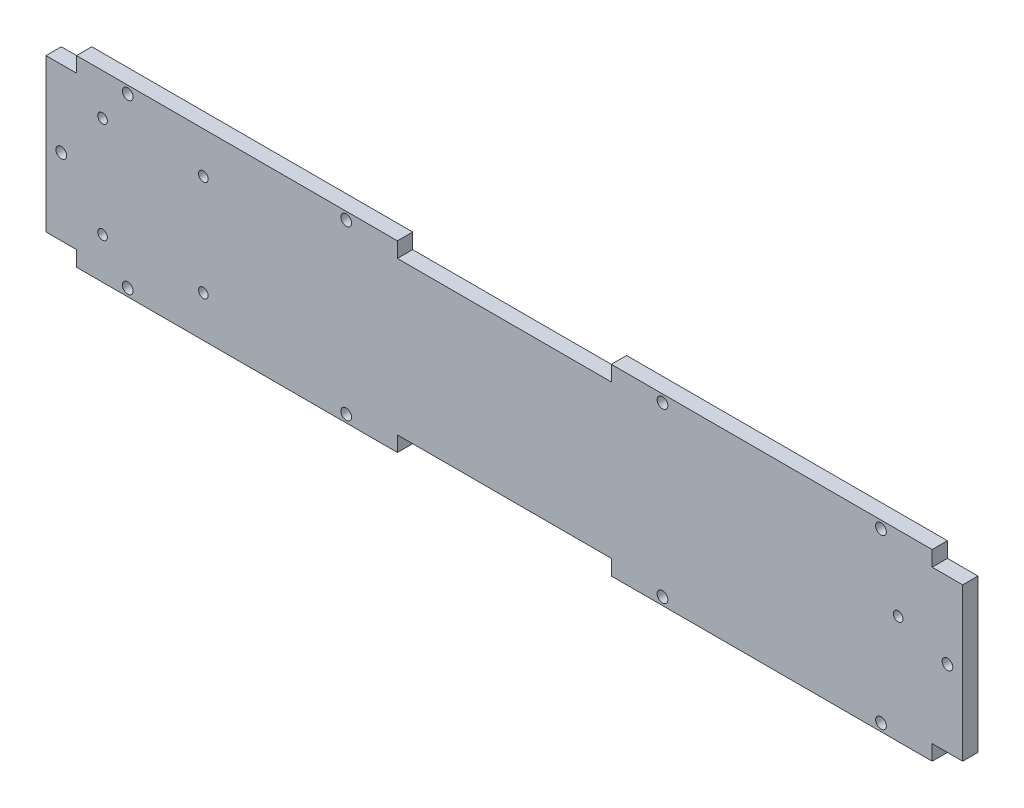
ISO-10303-21;
HEADER;
FILE_DESCRIPTION(('STEP AP214'),'2;1');
FILE_NAME('part.step','',(''),(''),'','','');
FILE_SCHEMA(('AUTOMOTIVE_DESIGN { 1 0 10303 214 1 1 1 1 }'));
ENDSEC;
DATA;
#1=APPLICATION_CONTEXT('core data for automotive mechanical design processes');
#2=APPLICATION_PROTOCOL_DEFINITION('international standard','automotive_design',2000,#1);
#3=PRODUCT_CONTEXT('',#1,'mechanical');
#4=PRODUCT('Part','Part','',(#3));
#5=PRODUCT_RELATED_PRODUCT_CATEGORY('part','',(#4));
#6=PRODUCT_DEFINITION_FORMATION('','',#4);
#7=PRODUCT_DEFINITION_CONTEXT('part definition',#1,'design');
#8=PRODUCT_DEFINITION('design','',#6,#7);
#9=PRODUCT_DEFINITION_SHAPE('','',#8);
#10=(LENGTH_UNIT() NAMED_UNIT(*) SI_UNIT(.MILLI.,.METRE.));
#11=(NAMED_UNIT(*) PLANE_ANGLE_UNIT() SI_UNIT($,.RADIAN.));
#12=(NAMED_UNIT(*) SI_UNIT($,.STERADIAN.) SOLID_ANGLE_UNIT());
#13=UNCERTAINTY_MEASURE_WITH_UNIT(LENGTH_MEASURE(1.E-05),#10,'distance_accuracy_value','');
#14=(GEOMETRIC_REPRESENTATION_CONTEXT(3) GLOBAL_UNCERTAINTY_ASSIGNED_CONTEXT((#13)) GLOBAL_UNIT_ASSIGNED_CONTEXT((#10,
#11,#12)) REPRESENTATION_CONTEXT('',''));
#15=CARTESIAN_POINT('',(0.,0.,0.));
#16=DIRECTION('',(0.,0.,1.));
#17=DIRECTION('',(1.,0.,0.));
#18=AXIS2_PLACEMENT_3D('',#15,#16,#17);
#19=CARTESIAN_POINT('',(35.,0.,5.));
#20=DIRECTION('',(-1.,0.,0.));
#21=DIRECTION('',(0.,0.,1.));
#22=AXIS2_PLACEMENT_3D('',#19,#20,#21);
#23=PLANE('',#22);
#24=DIRECTION('',(0.,1.,0.));
#25=VECTOR('',#24,1.);
#26=CARTESIAN_POINT('',(35.,0.,0.));
#27=LINE('',#26,#25);
#28=CARTESIAN_POINT('',(35.,-5.,0.));
#29=VERTEX_POINT('',#28);
#30=CARTESIAN_POINT('',(35.,0.,0.));
#31=VERTEX_POINT('',#30);
#32=EDGE_CURVE('E455',#29,#31,#27,.T.);
#33=ORIENTED_EDGE('',*,*,#32,.F.);
#34=DIRECTION('',(0.,0.,-1.));
#35=VECTOR('',#34,1.);
#36=CARTESIAN_POINT('',(35.,-5.,5.));
#37=LINE('',#36,#35);
#38=CARTESIAN_POINT('',(35.,-5.,5.));
#39=VERTEX_POINT('',#38);
#40=EDGE_CURVE('E424',#39,#29,#37,.T.);
#41=ORIENTED_EDGE('',*,*,#40,.F.);
#42=DIRECTION('',(0.,1.,0.));
#43=VECTOR('',#42,1.);
#44=CARTESIAN_POINT('',(35.,0.,5.));
#45=LINE('',#44,#43);
#46=CARTESIAN_POINT('',(35.,0.,5.));
#47=VERTEX_POINT('',#46);
#48=EDGE_CURVE('E472',#39,#47,#45,.T.);
#49=ORIENTED_EDGE('',*,*,#48,.T.);
#50=DIRECTION('',(0.,0.,-1.));
#51=VECTOR('',#50,1.);
#52=CARTESIAN_POINT('',(35.,0.,5.));
#53=LINE('',#52,#51);
#54=EDGE_CURVE('E420',#47,#31,#53,.T.);
#55=ORIENTED_EDGE('',*,*,#54,.T.);
#56=EDGE_LOOP('',(#33,#41,#49,#55));
#57=FACE_BOUND('',#56,.T.);
#58=ADVANCED_FACE('F161',(#57),#23,.T.);
#59=CARTESIAN_POINT('',(0.,-5.,5.));
#60=DIRECTION('',(0.,-1.,0.));
#61=DIRECTION('',(0.,0.,-1.));
#62=AXIS2_PLACEMENT_3D('',#59,#60,#61);
#63=PLANE('',#62);
#64=DIRECTION('',(-1.,0.,0.));
#65=VECTOR('',#64,1.);
#66=CARTESIAN_POINT('',(0.,-5.,0.));
#67=LINE('',#66,#65);
#68=CARTESIAN_POINT('',(140.,-5.,0.));
#69=VERTEX_POINT('',#68);
#70=EDGE_CURVE('E451',#69,#29,#67,.T.);
#71=ORIENTED_EDGE('',*,*,#70,.F.);
#72=DIRECTION('',(0.,0.,-1.));
#73=VECTOR('',#72,1.);
#74=CARTESIAN_POINT('',(140.,-5.,5.));
#75=LINE('',#74,#73);
#76=CARTESIAN_POINT('',(140.,-5.,5.));
#77=VERTEX_POINT('',#76);
#78=EDGE_CURVE('E428',#77,#69,#75,.T.);
#79=ORIENTED_EDGE('',*,*,#78,.F.);
#80=DIRECTION('',(-1.,0.,0.));
#81=VECTOR('',#80,1.);
#82=CARTESIAN_POINT('',(0.,-5.,5.));
#83=LINE('',#82,#81);
#84=EDGE_CURVE('E468',#77,#39,#83,.T.);
#85=ORIENTED_EDGE('',*,*,#84,.T.);
#86=ORIENTED_EDGE('',*,*,#40,.T.);
#87=EDGE_LOOP('',(#71,#79,#85,#86));
#88=FACE_BOUND('',#87,.T.);
#89=ADVANCED_FACE('F653',(#88),#63,.T.);
#90=CARTESIAN_POINT('',(140.,0.,5.));
#91=DIRECTION('',(-1.,0.,0.));
#92=DIRECTION('',(0.,0.,1.));
#93=AXIS2_PLACEMENT_3D('',#90,#91,#92);
#94=PLANE('',#93);
#95=DIRECTION('',(0.,0.,-1.));
#96=VECTOR('',#95,1.);
#97=CARTESIAN_POINT('',(140.,0.,5.));
#98=LINE('',#97,#96);
#99=CARTESIAN_POINT('',(140.,0.,5.));
#100=VERTEX_POINT('',#99);
#101=CARTESIAN_POINT('',(140.,0.,0.));
#102=VERTEX_POINT('',#101);
#103=EDGE_CURVE('E172',#100,#102,#98,.T.);
#104=ORIENTED_EDGE('',*,*,#103,.F.);
#105=DIRECTION('',(0.,1.,0.));
#106=VECTOR('',#105,1.);
#107=CARTESIAN_POINT('',(140.,0.,5.));
#108=LINE('',#107,#106);
#109=EDGE_CURVE('E464',#77,#100,#108,.T.);
#110=ORIENTED_EDGE('',*,*,#109,.F.);
#111=ORIENTED_EDGE('',*,*,#78,.T.);
#112=DIRECTION('',(0.,1.,0.));
#113=VECTOR('',#112,1.);
#114=CARTESIAN_POINT('',(140.,0.,0.));
#115=LINE('',#114,#113);
#116=EDGE_CURVE('E447',#69,#102,#115,.T.);
#117=ORIENTED_EDGE('',*,*,#116,.T.);
#118=EDGE_LOOP('',(#104,#110,#111,#117));
#119=FACE_BOUND('',#118,.T.);
#120=ADVANCED_FACE('F679',(#119),#94,.F.);
#121=CARTESIAN_POINT('',(0.,50.,5.));
#122=DIRECTION('',(0.,1.,0.));
#123=DIRECTION('',(0.,0.,1.));
#124=AXIS2_PLACEMENT_3D('',#121,#122,#123);
#125=PLANE('',#124);
#126=DIRECTION('',(0.,0.,-1.));
#127=VECTOR('',#126,1.);
#128=CARTESIAN_POINT('',(-35.,50.,5.));
#129=LINE('',#128,#127);
#130=CARTESIAN_POINT('',(-35.,50.,5.));
#131=VERTEX_POINT('',#130);
#132=CARTESIAN_POINT('',(-35.,50.,0.));
#133=VERTEX_POINT('',#132);
#134=EDGE_CURVE('E416',#131,#133,#129,.T.);
#135=ORIENTED_EDGE('',*,*,#134,.F.);
#136=DIRECTION('',(1.,0.,0.));
#137=VECTOR('',#136,1.);
#138=CARTESIAN_POINT('',(0.,50.,5.));
#139=LINE('',#138,#137);
#140=CARTESIAN_POINT('',(35.,50.,5.));
#141=VERTEX_POINT('',#140);
#142=EDGE_CURVE('E442',#131,#141,#139,.T.);
#143=ORIENTED_EDGE('',*,*,#142,.T.);
#144=DIRECTION('',(0.,0.,-1.));
#145=VECTOR('',#144,1.);
#146=CARTESIAN_POINT('',(35.,50.,5.));
#147=LINE('',#146,#145);
#148=CARTESIAN_POINT('',(35.,50.,0.));
#149=VERTEX_POINT('',#148);
#150=EDGE_CURVE('E165',#141,#149,#147,.T.);
#151=ORIENTED_EDGE('',*,*,#150,.T.);
#152=DIRECTION('',(1.,0.,0.));
#153=VECTOR('',#152,1.);
#154=CARTESIAN_POINT('',(0.,50.,0.));
#155=LINE('',#154,#153);
#156=EDGE_CURVE('E443',#133,#149,#155,.T.);
#157=ORIENTED_EDGE('',*,*,#156,.F.);
#158=EDGE_LOOP('',(#135,#143,#151,#157));
#159=FACE_BOUND('',#158,.T.);
#160=ADVANCED_FACE('F738',(#159),#125,.T.);
#161=CARTESIAN_POINT('',(0.,0.,5.));
#162=DIRECTION('',(0.,-1.,0.));
#163=DIRECTION('',(0.,0.,-1.));
#164=AXIS2_PLACEMENT_3D('',#161,#162,#163);
#165=PLANE('',#164);
#166=DIRECTION('',(-1.,0.,0.));
#167=VECTOR('',#166,1.);
#168=CARTESIAN_POINT('',(0.,0.,5.));
#169=LINE('',#168,#167);
#170=CARTESIAN_POINT('',(-35.,0.,5.));
#171=VERTEX_POINT('',#170);
#172=EDGE_CURVE('E446',#47,#171,#169,.T.);
#173=ORIENTED_EDGE('',*,*,#172,.T.);
#174=DIRECTION('',(0.,0.,-1.));
#175=VECTOR('',#174,1.);
#176=CARTESIAN_POINT('',(-35.,0.,5.));
#177=LINE('',#176,#175);
#178=CARTESIAN_POINT('',(-35.,0.,0.));
#179=VERTEX_POINT('',#178);
#180=EDGE_CURVE('E12',#171,#179,#177,.T.);
#181=ORIENTED_EDGE('',*,*,#180,.T.);
#182=DIRECTION('',(-1.,0.,0.));
#183=VECTOR('',#182,1.);
#184=CARTESIAN_POINT('',(0.,0.,0.));
#185=LINE('',#184,#183);
#186=EDGE_CURVE('E392',#31,#179,#185,.T.);
#187=ORIENTED_EDGE('',*,*,#186,.F.);
#188=ORIENTED_EDGE('',*,*,#54,.F.);
#189=EDGE_LOOP('',(#173,#181,#187,#188));
#190=FACE_BOUND('',#189,.T.);
#191=ADVANCED_FACE('F716',(#190),#165,.T.);
#192=CARTESIAN_POINT('',(0.,0.,0.));
#193=DIRECTION('',(0.,0.,1.));
#194=DIRECTION('',(1.,0.,0.));
#195=AXIS2_PLACEMENT_3D('',#192,#193,#194);
#196=PLANE('',#195);
#197=CARTESIAN_POINT('',(-98.5,41.5,0.));
#198=DIRECTION('',(0.,0.,1.));
#199=DIRECTION('',(-1.,0.,0.));
#200=AXIS2_PLACEMENT_3D('',#197,#198,#199);
#201=CIRCLE('',#200,1.57499999999993);
#202=CARTESIAN_POINT('',(-100.075,41.5,0.));
#203=VERTEX_POINT('',#202);
#204=EDGE_CURVE('E559',#203,#203,#201,.T.);
#205=ORIENTED_EDGE('',*,*,#204,.T.);
#206=EDGE_LOOP('',(#205));
#207=FACE_BOUND('',#206,.T.);
#208=CARTESIAN_POINT('',(-98.5,8.5,0.));
#209=DIRECTION('',(0.,0.,1.));
#210=DIRECTION('',(1.,0.,0.));
#211=AXIS2_PLACEMENT_3D('',#208,#209,#210);
#212=CIRCLE('',#211,1.57499999999993);
#213=CARTESIAN_POINT('',(-96.9250000000001,8.5,0.));
#214=VERTEX_POINT('',#213);
#215=EDGE_CURVE('E567',#214,#214,#212,.T.);
#216=ORIENTED_EDGE('',*,*,#215,.T.);
#217=EDGE_LOOP('',(#216));
#218=FACE_BOUND('',#217,.T.);
#219=CARTESIAN_POINT('',(-131.5,8.5,0.));
#220=DIRECTION('',(0.,0.,1.));
#221=DIRECTION('',(-1.,0.,0.));
#222=AXIS2_PLACEMENT_3D('',#219,#220,#221);
#223=CIRCLE('',#222,1.57500000000001);
#224=CARTESIAN_POINT('',(-133.075,8.5,0.));
#225=VERTEX_POINT('',#224);
#226=EDGE_CURVE('E568',#225,#225,#223,.T.);
#227=ORIENTED_EDGE('',*,*,#226,.T.);
#228=EDGE_LOOP('',(#227));
#229=FACE_BOUND('',#228,.T.);
#230=CARTESIAN_POINT('',(128.87,30.5,0.));
#231=DIRECTION('',(0.,0.,1.));
#232=DIRECTION('',(1.,0.,0.));
#233=AXIS2_PLACEMENT_3D('',#230,#231,#232);
#234=CIRCLE('',#233,1.57500000000001);
#235=CARTESIAN_POINT('',(130.445,30.5,0.));
#236=VERTEX_POINT('',#235);
#237=EDGE_CURVE('E583',#236,#236,#234,.T.);
#238=ORIENTED_EDGE('',*,*,#237,.T.);
#239=EDGE_LOOP('',(#238));
#240=FACE_BOUND('',#239,.T.);
#241=CARTESIAN_POINT('',(-131.5,41.5,0.));
#242=DIRECTION('',(0.,0.,1.));
#243=DIRECTION('',(1.,0.,0.));
#244=AXIS2_PLACEMENT_3D('',#241,#242,#243);
#245=CIRCLE('',#244,1.57500000000001);
#246=CARTESIAN_POINT('',(-129.925,41.5,0.));
#247=VERTEX_POINT('',#246);
#248=EDGE_CURVE('E551',#247,#247,#245,.T.);
#249=ORIENTED_EDGE('',*,*,#248,.T.);
#250=EDGE_LOOP('',(#249));
#251=FACE_BOUND('',#250,.T.);
#252=CARTESIAN_POINT('',(-145.,25.,0.));
#253=DIRECTION('',(0.,0.,1.));
#254=DIRECTION('',(1.,0.,0.));
#255=AXIS2_PLACEMENT_3D('',#252,#253,#254);
#256=CIRCLE('',#255,1.75000000000001);
#257=CARTESIAN_POINT('',(-143.25,25.,0.));
#258=VERTEX_POINT('',#257);
#259=EDGE_CURVE('E520',#258,#258,#256,.T.);
#260=ORIENTED_EDGE('',*,*,#259,.T.);
#261=EDGE_LOOP('',(#260));
#262=FACE_BOUND('',#261,.T.);
#263=CARTESIAN_POINT('',(145.,25.0000000000009,0.));
#264=DIRECTION('',(0.,0.,1.));
#265=DIRECTION('',(1.,0.,0.));
#266=AXIS2_PLACEMENT_3D('',#263,#264,#265);
#267=CIRCLE('',#266,1.75000000000001);
#268=CARTESIAN_POINT('',(146.75,25.0000000000009,0.));
#269=VERTEX_POINT('',#268);
#270=EDGE_CURVE('E542',#269,#269,#267,.T.);
#271=ORIENTED_EDGE('',*,*,#270,.T.);
#272=EDGE_LOOP('',(#271));
#273=FACE_BOUND('',#272,.T.);
#274=CARTESIAN_POINT('',(-51.75,-2.49999999999999,0.));
#275=DIRECTION('',(0.,0.,1.));
#276=DIRECTION('',(-1.,0.,0.));
#277=AXIS2_PLACEMENT_3D('',#274,#275,#276);
#278=CIRCLE('',#277,1.75000000000001);
#279=CARTESIAN_POINT('',(-53.5000000000001,-2.49999999999999,0.));
#280=VERTEX_POINT('',#279);
#281=EDGE_CURVE('E481',#280,#280,#278,.T.);
#282=ORIENTED_EDGE('',*,*,#281,.T.);
#283=EDGE_LOOP('',(#282));
#284=FACE_BOUND('',#283,.T.);
#285=CARTESIAN_POINT('',(51.75,-2.49999999999999,0.));
#286=DIRECTION('',(0.,0.,1.));
#287=DIRECTION('',(1.,0.,0.));
#288=AXIS2_PLACEMENT_3D('',#285,#286,#287);
#289=CIRCLE('',#288,1.75);
#290=CARTESIAN_POINT('',(53.5,-2.49999999999999,0.));
#291=VERTEX_POINT('',#290);
#292=EDGE_CURVE('E504',#291,#291,#289,.T.);
#293=ORIENTED_EDGE('',*,*,#292,.T.);
#294=EDGE_LOOP('',(#293));
#295=FACE_BOUND('',#294,.T.);
#296=CARTESIAN_POINT('',(123.25,-2.49999999999999,0.));
#297=DIRECTION('',(0.,0.,1.));
#298=DIRECTION('',(-1.,0.,0.));
#299=AXIS2_PLACEMENT_3D('',#296,#297,#298);
#300=CIRCLE('',#299,1.75);
#301=CARTESIAN_POINT('',(121.5,-2.49999999999999,0.));
#302=VERTEX_POINT('',#301);
#303=EDGE_CURVE('E496',#302,#302,#300,.T.);
#304=ORIENTED_EDGE('',*,*,#303,.T.);
#305=EDGE_LOOP('',(#304));
#306=FACE_BOUND('',#305,.T.);
#307=CARTESIAN_POINT('',(123.25,52.5,0.));
#308=DIRECTION('',(0.,0.,1.));
#309=DIRECTION('',(1.,0.,0.));
#310=AXIS2_PLACEMENT_3D('',#307,#308,#309);
#311=CIRCLE('',#310,1.75);
#312=CARTESIAN_POINT('',(125.,52.5,0.));
#313=VERTEX_POINT('',#312);
#314=EDGE_CURVE('E487',#313,#313,#311,.T.);
#315=ORIENTED_EDGE('',*,*,#314,.T.);
#316=EDGE_LOOP('',(#315));
#317=FACE_BOUND('',#316,.T.);
#318=CARTESIAN_POINT('',(51.75,52.5,0.));
#319=DIRECTION('',(0.,0.,1.));
#320=DIRECTION('',(-1.,0.,0.));
#321=AXIS2_PLACEMENT_3D('',#318,#319,#320);
#322=CIRCLE('',#321,1.75);
#323=CARTESIAN_POINT('',(50.,52.5,0.));
#324=VERTEX_POINT('',#323);
#325=EDGE_CURVE('E488',#324,#324,#322,.T.);
#326=ORIENTED_EDGE('',*,*,#325,.T.);
#327=EDGE_LOOP('',(#326));
#328=FACE_BOUND('',#327,.T.);
#329=CARTESIAN_POINT('',(-51.75,52.5,0.));
#330=DIRECTION('',(0.,0.,1.));
#331=DIRECTION('',(1.,0.,0.));
#332=AXIS2_PLACEMENT_3D('',#329,#330,#331);
#333=CIRCLE('',#332,1.75000000000001);
#334=CARTESIAN_POINT('',(-50.,52.5,0.));
#335=VERTEX_POINT('',#334);
#336=EDGE_CURVE('E528',#335,#335,#333,.T.);
#337=ORIENTED_EDGE('',*,*,#336,.T.);
#338=EDGE_LOOP('',(#337));
#339=FACE_BOUND('',#338,.T.);
#340=CARTESIAN_POINT('',(-123.25,52.5,0.));
#341=DIRECTION('',(0.,0.,1.));
#342=DIRECTION('',(-1.,0.,0.));
#343=AXIS2_PLACEMENT_3D('',#340,#341,#342);
#344=CIRCLE('',#343,1.75000000000001);
#345=CARTESIAN_POINT('',(-125.,52.5,0.));
#346=VERTEX_POINT('',#345);
#347=EDGE_CURVE('E519',#346,#346,#344,.T.);
#348=ORIENTED_EDGE('',*,*,#347,.T.);
#349=EDGE_LOOP('',(#348));
#350=FACE_BOUND('',#349,.T.);
#351=CARTESIAN_POINT('',(-123.25,-2.49999999999999,0.));
#352=DIRECTION('',(0.,0.,1.));
#353=DIRECTION('',(1.,0.,0.));
#354=AXIS2_PLACEMENT_3D('',#351,#352,#353);
#355=CIRCLE('',#354,1.75000000000001);
#356=CARTESIAN_POINT('',(-121.5,-2.49999999999999,0.));
#357=VERTEX_POINT('',#356);
#358=EDGE_CURVE('E278',#357,#357,#355,.T.);
#359=ORIENTED_EDGE('',*,*,#358,.T.);
#360=EDGE_LOOP('',(#359));
#361=FACE_BOUND('',#360,.T.);
#362=DIRECTION('',(0.,-1.,0.));
#363=VECTOR('',#362,1.);
#364=CARTESIAN_POINT('',(140.,55.,0.));
#365=LINE('',#364,#363);
#366=CARTESIAN_POINT('',(140.,55.,0.));
#367=VERTEX_POINT('',#366);
#368=CARTESIAN_POINT('',(140.,50.,0.));
#369=VERTEX_POINT('',#368);
#370=EDGE_CURVE('E267',#367,#369,#365,.T.);
#371=ORIENTED_EDGE('',*,*,#370,.T.);
#372=DIRECTION('',(1.,0.,0.));
#373=VECTOR('',#372,1.);
#374=CARTESIAN_POINT('',(140.,50.,0.));
#375=LINE('',#374,#373);
#376=CARTESIAN_POINT('',(150.,50.,0.));
#377=VERTEX_POINT('',#376);
#378=EDGE_CURVE('E301',#369,#377,#375,.T.);
#379=ORIENTED_EDGE('',*,*,#378,.T.);
#380=DIRECTION('',(0.,1.,0.));
#381=VECTOR('',#380,1.);
#382=CARTESIAN_POINT('',(150.,0.,0.));
#383=LINE('',#382,#381);
#384=CARTESIAN_POINT('',(150.,0.,0.));
#385=VERTEX_POINT('',#384);
#386=EDGE_CURVE('E341',#385,#377,#383,.T.);
#387=ORIENTED_EDGE('',*,*,#386,.F.);
#388=DIRECTION('',(1.,0.,0.));
#389=VECTOR('',#388,1.);
#390=CARTESIAN_POINT('',(140.,0.,0.));
#391=LINE('',#390,#389);
#392=EDGE_CURVE('E337',#102,#385,#391,.T.);
#393=ORIENTED_EDGE('',*,*,#392,.F.);
#394=ORIENTED_EDGE('',*,*,#116,.F.);
#395=ORIENTED_EDGE('',*,*,#70,.T.);
#396=ORIENTED_EDGE('',*,*,#32,.T.);
#397=ORIENTED_EDGE('',*,*,#186,.T.);
#398=DIRECTION('',(0.,1.,0.));
#399=VECTOR('',#398,1.);
#400=CARTESIAN_POINT('',(-35.,-5.,0.));
#401=LINE('',#400,#399);
#402=CARTESIAN_POINT('',(-35.,-5.,0.));
#403=VERTEX_POINT('',#402);
#404=EDGE_CURVE('E358',#403,#179,#401,.T.);
#405=ORIENTED_EDGE('',*,*,#404,.F.);
#406=DIRECTION('',(1.,0.,0.));
#407=VECTOR('',#406,1.);
#408=CARTESIAN_POINT('',(-140.,-5.,0.));
#409=LINE('',#408,#407);
#410=CARTESIAN_POINT('',(-140.,-5.,0.));
#411=VERTEX_POINT('',#410);
#412=EDGE_CURVE('E398',#411,#403,#409,.T.);
#413=ORIENTED_EDGE('',*,*,#412,.F.);
#414=DIRECTION('',(0.,1.,0.));
#415=VECTOR('',#414,1.);
#416=CARTESIAN_POINT('',(-140.,-5.,0.));
#417=LINE('',#416,#415);
#418=CARTESIAN_POINT('',(-140.,0.,0.));
#419=VERTEX_POINT('',#418);
#420=EDGE_CURVE('E393',#411,#419,#417,.T.);
#421=ORIENTED_EDGE('',*,*,#420,.T.);
#422=DIRECTION('',(-1.,0.,0.));
#423=VECTOR('',#422,1.);
#424=CARTESIAN_POINT('',(-140.,0.,0.));
#425=LINE('',#424,#423);
#426=CARTESIAN_POINT('',(-150.,0.,0.));
#427=VERTEX_POINT('',#426);
#428=EDGE_CURVE('E363',#419,#427,#425,.T.);
#429=ORIENTED_EDGE('',*,*,#428,.T.);
#430=DIRECTION('',(0.,1.,0.));
#431=VECTOR('',#430,1.);
#432=CARTESIAN_POINT('',(-150.,0.,0.));
#433=LINE('',#432,#431);
#434=CARTESIAN_POINT('',(-150.,50.,0.));
#435=VERTEX_POINT('',#434);
#436=EDGE_CURVE('E368',#427,#435,#433,.T.);
#437=ORIENTED_EDGE('',*,*,#436,.T.);
#438=DIRECTION('',(-1.,0.,0.));
#439=VECTOR('',#438,1.);
#440=CARTESIAN_POINT('',(-140.,50.,0.));
#441=LINE('',#440,#439);
#442=CARTESIAN_POINT('',(-140.,50.,0.));
#443=VERTEX_POINT('',#442);
#444=EDGE_CURVE('E336',#443,#435,#441,.T.);
#445=ORIENTED_EDGE('',*,*,#444,.F.);
#446=DIRECTION('',(0.,-1.,0.));
#447=VECTOR('',#446,1.);
#448=CARTESIAN_POINT('',(-140.,55.,0.));
#449=LINE('',#448,#447);
#450=CARTESIAN_POINT('',(-140.,55.,0.));
#451=VERTEX_POINT('',#450);
#452=EDGE_CURVE('E258',#451,#443,#449,.T.);
#453=ORIENTED_EDGE('',*,*,#452,.F.);
#454=DIRECTION('',(1.,0.,0.));
#455=VECTOR('',#454,1.);
#456=CARTESIAN_POINT('',(-140.,55.,0.));
#457=LINE('',#456,#455);
#458=CARTESIAN_POINT('',(-35.,55.,0.));
#459=VERTEX_POINT('',#458);
#460=EDGE_CURVE('E306',#451,#459,#457,.T.);
#461=ORIENTED_EDGE('',*,*,#460,.T.);
#462=DIRECTION('',(0.,-1.,0.));
#463=VECTOR('',#462,1.);
#464=CARTESIAN_POINT('',(-35.,55.,0.));
#465=LINE('',#464,#463);
#466=EDGE_CURVE('E311',#459,#133,#465,.T.);
#467=ORIENTED_EDGE('',*,*,#466,.T.);
#468=ORIENTED_EDGE('',*,*,#156,.T.);
#469=DIRECTION('',(0.,-1.,0.));
#470=VECTOR('',#469,1.);
#471=CARTESIAN_POINT('',(35.,55.,0.));
#472=LINE('',#471,#470);
#473=CARTESIAN_POINT('',(35.,55.,0.));
#474=VERTEX_POINT('',#473);
#475=EDGE_CURVE('E269',#474,#149,#472,.T.);
#476=ORIENTED_EDGE('',*,*,#475,.F.);
#477=DIRECTION('',(-1.,0.,0.));
#478=VECTOR('',#477,1.);
#479=CARTESIAN_POINT('',(140.,55.,0.));
#480=LINE('',#479,#478);
#481=EDGE_CURVE('E247',#367,#474,#480,.T.);
#482=ORIENTED_EDGE('',*,*,#481,.F.);
#483=EDGE_LOOP('',(#371,#379,#387,#393,#394,#395,#396,#397,#405,#413,#421,#429,#437,#445,#453,
#461,#467,#468,#476,#482));
#484=FACE_BOUND('',#483,.T.);
#485=ADVANCED_FACE('F264',(#207,#218,#229,#240,#251,#262,#273,#284,#295,#306,#317,#328,#339,
#350,#361,#484),#196,.F.);
#486=CARTESIAN_POINT('',(0.,0.,5.));
#487=DIRECTION('',(0.,0.,1.));
#488=DIRECTION('',(1.,0.,0.));
#489=AXIS2_PLACEMENT_3D('',#486,#487,#488);
#490=PLANE('',#489);
#491=CARTESIAN_POINT('',(-98.5,41.5,5.));
#492=DIRECTION('',(0.,0.,1.));
#493=DIRECTION('',(-1.,0.,0.));
#494=AXIS2_PLACEMENT_3D('',#491,#492,#493);
#495=CIRCLE('',#494,1.57499999999993);
#496=CARTESIAN_POINT('',(-100.075,41.5,5.));
#497=VERTEX_POINT('',#496);
#498=EDGE_CURVE('E572',#497,#497,#495,.T.);
#499=ORIENTED_EDGE('',*,*,#498,.F.);
#500=EDGE_LOOP('',(#499));
#501=FACE_BOUND('',#500,.T.);
#502=CARTESIAN_POINT('',(-98.5,8.5,5.));
#503=DIRECTION('',(0.,0.,1.));
#504=DIRECTION('',(1.,0.,0.));
#505=AXIS2_PLACEMENT_3D('',#502,#503,#504);
#506=CIRCLE('',#505,1.57499999999993);
#507=CARTESIAN_POINT('',(-96.9250000000001,8.5,5.));
#508=VERTEX_POINT('',#507);
#509=EDGE_CURVE('E563',#508,#508,#506,.T.);
#510=ORIENTED_EDGE('',*,*,#509,.F.);
#511=EDGE_LOOP('',(#510));
#512=FACE_BOUND('',#511,.T.);
#513=CARTESIAN_POINT('',(-131.5,8.5,5.));
#514=DIRECTION('',(0.,0.,1.));
#515=DIRECTION('',(-1.,0.,0.));
#516=AXIS2_PLACEMENT_3D('',#513,#514,#515);
#517=CIRCLE('',#516,1.57500000000001);
#518=CARTESIAN_POINT('',(-133.075,8.5,5.));
#519=VERTEX_POINT('',#518);
#520=EDGE_CURVE('E587',#519,#519,#517,.T.);
#521=ORIENTED_EDGE('',*,*,#520,.F.);
#522=EDGE_LOOP('',(#521));
#523=FACE_BOUND('',#522,.T.);
#524=CARTESIAN_POINT('',(128.87,30.5,5.));
#525=DIRECTION('',(0.,0.,1.));
#526=DIRECTION('',(1.,0.,0.));
#527=AXIS2_PLACEMENT_3D('',#524,#525,#526);
#528=CIRCLE('',#527,1.57500000000001);
#529=CARTESIAN_POINT('',(130.445,30.5,5.));
#530=VERTEX_POINT('',#529);
#531=EDGE_CURVE('E579',#530,#530,#528,.T.);
#532=ORIENTED_EDGE('',*,*,#531,.F.);
#533=EDGE_LOOP('',(#532));
#534=FACE_BOUND('',#533,.T.);
#535=CARTESIAN_POINT('',(-131.5,41.5,5.));
#536=DIRECTION('',(0.,0.,1.));
#537=DIRECTION('',(1.,0.,0.));
#538=AXIS2_PLACEMENT_3D('',#535,#536,#537);
#539=CIRCLE('',#538,1.57500000000001);
#540=CARTESIAN_POINT('',(-129.925,41.5,5.));
#541=VERTEX_POINT('',#540);
#542=EDGE_CURVE('E555',#541,#541,#539,.T.);
#543=ORIENTED_EDGE('',*,*,#542,.F.);
#544=EDGE_LOOP('',(#543));
#545=FACE_BOUND('',#544,.T.);
#546=CARTESIAN_POINT('',(-145.,25.,5.));
#547=DIRECTION('',(0.,0.,1.));
#548=DIRECTION('',(1.,0.,0.));
#549=AXIS2_PLACEMENT_3D('',#546,#547,#548);
#550=CIRCLE('',#549,1.75000000000001);
#551=CARTESIAN_POINT('',(-143.25,25.,5.));
#552=VERTEX_POINT('',#551);
#553=EDGE_CURVE('E546',#552,#552,#550,.T.);
#554=ORIENTED_EDGE('',*,*,#553,.F.);
#555=EDGE_LOOP('',(#554));
#556=FACE_BOUND('',#555,.T.);
#557=CARTESIAN_POINT('',(145.,25.0000000000009,5.));
#558=DIRECTION('',(0.,0.,1.));
#559=DIRECTION('',(-1.,0.,0.));
#560=AXIS2_PLACEMENT_3D('',#557,#558,#559);
#561=CIRCLE('',#560,1.75000000000001);
#562=CARTESIAN_POINT('',(143.25,25.0000000000009,5.));
#563=VERTEX_POINT('',#562);
#564=EDGE_CURVE('E547',#563,#563,#561,.T.);
#565=ORIENTED_EDGE('',*,*,#564,.F.);
#566=EDGE_LOOP('',(#565));
#567=FACE_BOUND('',#566,.T.);
#568=CARTESIAN_POINT('',(-51.75,-2.49999999999999,5.));
#569=DIRECTION('',(0.,0.,1.));
#570=DIRECTION('',(-1.,0.,0.));
#571=AXIS2_PLACEMENT_3D('',#568,#569,#570);
#572=CIRCLE('',#571,1.75000000000001);
#573=CARTESIAN_POINT('',(-53.5000000000001,-2.49999999999999,5.));
#574=VERTEX_POINT('',#573);
#575=EDGE_CURVE('E508',#574,#574,#572,.T.);
#576=ORIENTED_EDGE('',*,*,#575,.F.);
#577=EDGE_LOOP('',(#576));
#578=FACE_BOUND('',#577,.T.);
#579=CARTESIAN_POINT('',(51.75,-2.49999999999999,5.));
#580=DIRECTION('',(0.,0.,1.));
#581=DIRECTION('',(1.,0.,0.));
#582=AXIS2_PLACEMENT_3D('',#579,#580,#581);
#583=CIRCLE('',#582,1.75);
#584=CARTESIAN_POINT('',(53.5,-2.49999999999999,5.));
#585=VERTEX_POINT('',#584);
#586=EDGE_CURVE('E500',#585,#585,#583,.T.);
#587=ORIENTED_EDGE('',*,*,#586,.F.);
#588=EDGE_LOOP('',(#587));
#589=FACE_BOUND('',#588,.T.);
#590=CARTESIAN_POINT('',(123.25,-2.49999999999999,5.));
#591=DIRECTION('',(0.,0.,1.));
#592=DIRECTION('',(-1.,0.,0.));
#593=AXIS2_PLACEMENT_3D('',#590,#591,#592);
#594=CIRCLE('',#593,1.75);
#595=CARTESIAN_POINT('',(121.5,-2.49999999999999,5.));
#596=VERTEX_POINT('',#595);
#597=EDGE_CURVE('E492',#596,#596,#594,.T.);
#598=ORIENTED_EDGE('',*,*,#597,.F.);
#599=EDGE_LOOP('',(#598));
#600=FACE_BOUND('',#599,.T.);
#601=CARTESIAN_POINT('',(123.25,52.5,5.));
#602=DIRECTION('',(0.,0.,1.));
#603=DIRECTION('',(1.,0.,0.));
#604=AXIS2_PLACEMENT_3D('',#601,#602,#603);
#605=CIRCLE('',#604,1.75);
#606=CARTESIAN_POINT('',(125.,52.5,5.));
#607=VERTEX_POINT('',#606);
#608=EDGE_CURVE('E483',#607,#607,#605,.T.);
#609=ORIENTED_EDGE('',*,*,#608,.F.);
#610=EDGE_LOOP('',(#609));
#611=FACE_BOUND('',#610,.T.);
#612=CARTESIAN_POINT('',(51.75,52.5,5.));
#613=DIRECTION('',(0.,0.,1.));
#614=DIRECTION('',(-1.,0.,0.));
#615=AXIS2_PLACEMENT_3D('',#612,#613,#614);
#616=CIRCLE('',#615,1.75);
#617=CARTESIAN_POINT('',(50.,52.5,5.));
#618=VERTEX_POINT('',#617);
#619=EDGE_CURVE('E532',#618,#618,#616,.T.);
#620=ORIENTED_EDGE('',*,*,#619,.F.);
#621=EDGE_LOOP('',(#620));
#622=FACE_BOUND('',#621,.T.);
#623=CARTESIAN_POINT('',(-51.75,52.5,5.));
#624=DIRECTION('',(0.,0.,1.));
#625=DIRECTION('',(1.,0.,0.));
#626=AXIS2_PLACEMENT_3D('',#623,#624,#625);
#627=CIRCLE('',#626,1.75000000000001);
#628=CARTESIAN_POINT('',(-50.,52.5,5.));
#629=VERTEX_POINT('',#628);
#630=EDGE_CURVE('E524',#629,#629,#627,.T.);
#631=ORIENTED_EDGE('',*,*,#630,.F.);
#632=EDGE_LOOP('',(#631));
#633=FACE_BOUND('',#632,.T.);
#634=CARTESIAN_POINT('',(-123.25,52.5,5.));
#635=DIRECTION('',(0.,0.,1.));
#636=DIRECTION('',(-1.,0.,0.));
#637=AXIS2_PLACEMENT_3D('',#634,#635,#636);
#638=CIRCLE('',#637,1.75000000000001);
#639=CARTESIAN_POINT('',(-125.,52.5,5.));
#640=VERTEX_POINT('',#639);
#641=EDGE_CURVE('E515',#640,#640,#638,.T.);
#642=ORIENTED_EDGE('',*,*,#641,.F.);
#643=EDGE_LOOP('',(#642));
#644=FACE_BOUND('',#643,.T.);
#645=CARTESIAN_POINT('',(-123.25,-2.49999999999999,5.));
#646=DIRECTION('',(0.,0.,1.));
#647=DIRECTION('',(1.,0.,0.));
#648=AXIS2_PLACEMENT_3D('',#645,#646,#647);
#649=CIRCLE('',#648,1.75000000000001);
#650=CARTESIAN_POINT('',(-121.5,-2.49999999999999,5.));
#651=VERTEX_POINT('',#650);
#652=EDGE_CURVE('E284',#651,#651,#649,.T.);
#653=ORIENTED_EDGE('',*,*,#652,.F.);
#654=EDGE_LOOP('',(#653));
#655=FACE_BOUND('',#654,.T.);
#656=ORIENTED_EDGE('',*,*,#172,.F.);
#657=ORIENTED_EDGE('',*,*,#48,.F.);
#658=ORIENTED_EDGE('',*,*,#84,.F.);
#659=ORIENTED_EDGE('',*,*,#109,.T.);
#660=DIRECTION('',(1.,0.,0.));
#661=VECTOR('',#660,1.);
#662=CARTESIAN_POINT('',(140.,0.,5.));
#663=LINE('',#662,#661);
#664=CARTESIAN_POINT('',(150.,0.,5.));
#665=VERTEX_POINT('',#664);
#666=EDGE_CURVE('E332',#100,#665,#663,.T.);
#667=ORIENTED_EDGE('',*,*,#666,.T.);
#668=DIRECTION('',(0.,1.,0.));
#669=VECTOR('',#668,1.);
#670=CARTESIAN_POINT('',(150.,0.,5.));
#671=LINE('',#670,#669);
#672=CARTESIAN_POINT('',(150.,50.,5.));
#673=VERTEX_POINT('',#672);
#674=EDGE_CURVE('E349',#665,#673,#671,.T.);
#675=ORIENTED_EDGE('',*,*,#674,.T.);
#676=DIRECTION('',(1.,0.,0.));
#677=VECTOR('',#676,1.);
#678=CARTESIAN_POINT('',(140.,50.,5.));
#679=LINE('',#678,#677);
#680=CARTESIAN_POINT('',(140.,50.,5.));
#681=VERTEX_POINT('',#680);
#682=EDGE_CURVE('E340',#681,#673,#679,.T.);
#683=ORIENTED_EDGE('',*,*,#682,.F.);
#684=DIRECTION('',(0.,-1.,0.));
#685=VECTOR('',#684,1.);
#686=CARTESIAN_POINT('',(140.,55.,5.));
#687=LINE('',#686,#685);
#688=CARTESIAN_POINT('',(140.,55.,5.));
#689=VERTEX_POINT('',#688);
#690=EDGE_CURVE('E271',#689,#681,#687,.T.);
#691=ORIENTED_EDGE('',*,*,#690,.F.);
#692=DIRECTION('',(-1.,0.,0.));
#693=VECTOR('',#692,1.);
#694=CARTESIAN_POINT('',(140.,55.,5.));
#695=LINE('',#694,#693);
#696=CARTESIAN_POINT('',(35.,55.,5.));
#697=VERTEX_POINT('',#696);
#698=EDGE_CURVE('E252',#689,#697,#695,.T.);
#699=ORIENTED_EDGE('',*,*,#698,.T.);
#700=DIRECTION('',(0.,-1.,0.));
#701=VECTOR('',#700,1.);
#702=CARTESIAN_POINT('',(35.,55.,5.));
#703=LINE('',#702,#701);
#704=EDGE_CURVE('E290',#697,#141,#703,.T.);
#705=ORIENTED_EDGE('',*,*,#704,.T.);
#706=ORIENTED_EDGE('',*,*,#142,.F.);
#707=DIRECTION('',(0.,-1.,0.));
#708=VECTOR('',#707,1.);
#709=CARTESIAN_POINT('',(-35.,55.,5.));
#710=LINE('',#709,#708);
#711=CARTESIAN_POINT('',(-35.,55.,5.));
#712=VERTEX_POINT('',#711);
#713=EDGE_CURVE('E321',#712,#131,#710,.T.);
#714=ORIENTED_EDGE('',*,*,#713,.F.);
#715=DIRECTION('',(1.,0.,0.));
#716=VECTOR('',#715,1.);
#717=CARTESIAN_POINT('',(-140.,55.,5.));
#718=LINE('',#717,#716);
#719=CARTESIAN_POINT('',(-140.,55.,5.));
#720=VERTEX_POINT('',#719);
#721=EDGE_CURVE('E305',#720,#712,#718,.T.);
#722=ORIENTED_EDGE('',*,*,#721,.F.);
#723=DIRECTION('',(0.,-1.,0.));
#724=VECTOR('',#723,1.);
#725=CARTESIAN_POINT('',(-140.,55.,5.));
#726=LINE('',#725,#724);
#727=CARTESIAN_POINT('',(-140.,50.,5.));
#728=VERTEX_POINT('',#727);
#729=EDGE_CURVE('E310',#720,#728,#726,.T.);
#730=ORIENTED_EDGE('',*,*,#729,.T.);
#731=DIRECTION('',(-1.,0.,0.));
#732=VECTOR('',#731,1.);
#733=CARTESIAN_POINT('',(-140.,50.,5.));
#734=LINE('',#733,#732);
#735=CARTESIAN_POINT('',(-150.,50.,5.));
#736=VERTEX_POINT('',#735);
#737=EDGE_CURVE('E367',#728,#736,#734,.T.);
#738=ORIENTED_EDGE('',*,*,#737,.T.);
#739=DIRECTION('',(0.,1.,0.));
#740=VECTOR('',#739,1.);
#741=CARTESIAN_POINT('',(-150.,0.,5.));
#742=LINE('',#741,#740);
#743=CARTESIAN_POINT('',(-150.,0.,5.));
#744=VERTEX_POINT('',#743);
#745=EDGE_CURVE('E378',#744,#736,#742,.T.);
#746=ORIENTED_EDGE('',*,*,#745,.F.);
#747=DIRECTION('',(-1.,0.,0.));
#748=VECTOR('',#747,1.);
#749=CARTESIAN_POINT('',(-140.,0.,5.));
#750=LINE('',#749,#748);
#751=CARTESIAN_POINT('',(-140.,0.,5.));
#752=VERTEX_POINT('',#751);
#753=EDGE_CURVE('E362',#752,#744,#750,.T.);
#754=ORIENTED_EDGE('',*,*,#753,.F.);
#755=DIRECTION('',(0.,1.,0.));
#756=VECTOR('',#755,1.);
#757=CARTESIAN_POINT('',(-140.,-5.,5.));
#758=LINE('',#757,#756);
#759=CARTESIAN_POINT('',(-140.,-5.,5.));
#760=VERTEX_POINT('',#759);
#761=EDGE_CURVE('E389',#760,#752,#758,.T.);
#762=ORIENTED_EDGE('',*,*,#761,.F.);
#763=DIRECTION('',(1.,0.,0.));
#764=VECTOR('',#763,1.);
#765=CARTESIAN_POINT('',(-140.,-5.,5.));
#766=LINE('',#765,#764);
#767=CARTESIAN_POINT('',(-35.,-5.,5.));
#768=VERTEX_POINT('',#767);
#769=EDGE_CURVE('E407',#760,#768,#766,.T.);
#770=ORIENTED_EDGE('',*,*,#769,.T.);
#771=DIRECTION('',(0.,1.,0.));
#772=VECTOR('',#771,1.);
#773=CARTESIAN_POINT('',(-35.,-5.,5.));
#774=LINE('',#773,#772);
#775=EDGE_CURVE('E397',#768,#171,#774,.T.);
#776=ORIENTED_EDGE('',*,*,#775,.T.);
#777=EDGE_LOOP('',(#656,#657,#658,#659,#667,#675,#683,#691,#699,#705,#706,#714,#722,#730,#738,
#746,#754,#762,#770,#776));
#778=FACE_BOUND('',#777,.T.);
#779=ADVANCED_FACE('F605',(#501,#512,#523,#534,#545,#556,#567,#578,#589,#600,#611,#622,#633,
#644,#655,#778),#490,.T.);
#780=CARTESIAN_POINT('',(140.,55.,5.));
#781=DIRECTION('',(0.,-1.,0.));
#782=DIRECTION('',(0.,0.,-1.));
#783=AXIS2_PLACEMENT_3D('',#780,#781,#782);
#784=PLANE('',#783);
#785=ORIENTED_EDGE('',*,*,#481,.T.);
#786=DIRECTION('',(0.,0.,-1.));
#787=VECTOR('',#786,1.);
#788=CARTESIAN_POINT('',(35.,55.,5.));
#789=LINE('',#788,#787);
#790=EDGE_CURVE('E259',#697,#474,#789,.T.);
#791=ORIENTED_EDGE('',*,*,#790,.F.);
#792=ORIENTED_EDGE('',*,*,#698,.F.);
#793=DIRECTION('',(0.,0.,-1.));
#794=VECTOR('',#793,1.);
#795=CARTESIAN_POINT('',(140.,55.,5.));
#796=LINE('',#795,#794);
#797=EDGE_CURVE('E250',#689,#367,#796,.T.);
#798=ORIENTED_EDGE('',*,*,#797,.T.);
#799=EDGE_LOOP('',(#785,#791,#792,#798));
#800=FACE_BOUND('',#799,.T.);
#801=ADVANCED_FACE('F251',(#800),#784,.F.);
#802=CARTESIAN_POINT('',(35.,55.,5.));
#803=DIRECTION('',(1.,0.,0.));
#804=DIRECTION('',(0.,0.,-1.));
#805=AXIS2_PLACEMENT_3D('',#802,#803,#804);
#806=PLANE('',#805);
#807=ORIENTED_EDGE('',*,*,#475,.T.);
#808=ORIENTED_EDGE('',*,*,#150,.F.);
#809=ORIENTED_EDGE('',*,*,#704,.F.);
#810=ORIENTED_EDGE('',*,*,#790,.T.);
#811=EDGE_LOOP('',(#807,#808,#809,#810));
#812=FACE_BOUND('',#811,.T.);
#813=ADVANCED_FACE('F772',(#812),#806,.F.);
#814=CARTESIAN_POINT('',(140.,55.,5.));
#815=DIRECTION('',(1.,0.,0.));
#816=DIRECTION('',(0.,0.,-1.));
#817=AXIS2_PLACEMENT_3D('',#814,#815,#816);
#818=PLANE('',#817);
#819=ORIENTED_EDGE('',*,*,#370,.F.);
#820=ORIENTED_EDGE('',*,*,#797,.F.);
#821=ORIENTED_EDGE('',*,*,#690,.T.);
#822=DIRECTION('',(0.,0.,-1.));
#823=VECTOR('',#822,1.);
#824=CARTESIAN_POINT('',(140.,50.,5.));
#825=LINE('',#824,#823);
#826=EDGE_CURVE('E275',#681,#369,#825,.T.);
#827=ORIENTED_EDGE('',*,*,#826,.T.);
#828=EDGE_LOOP('',(#819,#820,#821,#827));
#829=FACE_BOUND('',#828,.T.);
#830=ADVANCED_FACE('F163',(#829),#818,.T.);
#831=CARTESIAN_POINT('',(140.,0.,5.));
#832=DIRECTION('',(0.,1.,0.));
#833=DIRECTION('',(0.,0.,1.));
#834=AXIS2_PLACEMENT_3D('',#831,#832,#833);
#835=PLANE('',#834);
#836=ORIENTED_EDGE('',*,*,#392,.T.);
#837=DIRECTION('',(0.,0.,-1.));
#838=VECTOR('',#837,1.);
#839=CARTESIAN_POINT('',(150.,0.,5.));
#840=LINE('',#839,#838);
#841=EDGE_CURVE('E331',#665,#385,#840,.T.);
#842=ORIENTED_EDGE('',*,*,#841,.F.);
#843=ORIENTED_EDGE('',*,*,#666,.F.);
#844=ORIENTED_EDGE('',*,*,#103,.T.);
#845=EDGE_LOOP('',(#836,#842,#843,#844));
#846=FACE_BOUND('',#845,.T.);
#847=ADVANCED_FACE('F684',(#846),#835,.F.);
#848=CARTESIAN_POINT('',(150.,0.,5.));
#849=DIRECTION('',(-1.,0.,0.));
#850=DIRECTION('',(0.,0.,1.));
#851=AXIS2_PLACEMENT_3D('',#848,#849,#850);
#852=PLANE('',#851);
#853=ORIENTED_EDGE('',*,*,#386,.T.);
#854=DIRECTION('',(0.,0.,-1.));
#855=VECTOR('',#854,1.);
#856=CARTESIAN_POINT('',(150.,50.,5.));
#857=LINE('',#856,#855);
#858=EDGE_CURVE('E328',#673,#377,#857,.T.);
#859=ORIENTED_EDGE('',*,*,#858,.F.);
#860=ORIENTED_EDGE('',*,*,#674,.F.);
#861=ORIENTED_EDGE('',*,*,#841,.T.);
#862=EDGE_LOOP('',(#853,#859,#860,#861));
#863=FACE_BOUND('',#862,.T.);
#864=ADVANCED_FACE('F719',(#863),#852,.F.);
#865=CARTESIAN_POINT('',(140.,50.,5.));
#866=DIRECTION('',(0.,1.,0.));
#867=DIRECTION('',(0.,0.,1.));
#868=AXIS2_PLACEMENT_3D('',#865,#866,#867);
#869=PLANE('',#868);
#870=ORIENTED_EDGE('',*,*,#378,.F.);
#871=ORIENTED_EDGE('',*,*,#826,.F.);
#872=ORIENTED_EDGE('',*,*,#682,.T.);
#873=ORIENTED_EDGE('',*,*,#858,.T.);
#874=EDGE_LOOP('',(#870,#871,#872,#873));
#875=FACE_BOUND('',#874,.T.);
#876=ADVANCED_FACE('F723',(#875),#869,.T.);
#877=CARTESIAN_POINT('',(-35.,55.,5.));
#878=DIRECTION('',(1.,0.,0.));
#879=DIRECTION('',(0.,0.,-1.));
#880=AXIS2_PLACEMENT_3D('',#877,#878,#879);
#881=PLANE('',#880);
#882=ORIENTED_EDGE('',*,*,#466,.F.);
#883=DIRECTION('',(0.,0.,-1.));
#884=VECTOR('',#883,1.);
#885=CARTESIAN_POINT('',(-35.,55.,5.));
#886=LINE('',#885,#884);
#887=EDGE_CURVE('E298',#712,#459,#886,.T.);
#888=ORIENTED_EDGE('',*,*,#887,.F.);
#889=ORIENTED_EDGE('',*,*,#713,.T.);
#890=ORIENTED_EDGE('',*,*,#134,.T.);
#891=EDGE_LOOP('',(#882,#888,#889,#890));
#892=FACE_BOUND('',#891,.T.);
#893=ADVANCED_FACE('F725',(#892),#881,.T.);
#894=CARTESIAN_POINT('',(-140.,55.,5.));
#895=DIRECTION('',(0.,1.,0.));
#896=DIRECTION('',(0.,0.,1.));
#897=AXIS2_PLACEMENT_3D('',#894,#895,#896);
#898=PLANE('',#897);
#899=ORIENTED_EDGE('',*,*,#460,.F.);
#900=DIRECTION('',(0.,0.,-1.));
#901=VECTOR('',#900,1.);
#902=CARTESIAN_POINT('',(-140.,55.,5.));
#903=LINE('',#902,#901);
#904=EDGE_CURVE('E302',#720,#451,#903,.T.);
#905=ORIENTED_EDGE('',*,*,#904,.F.);
#906=ORIENTED_EDGE('',*,*,#721,.T.);
#907=ORIENTED_EDGE('',*,*,#887,.T.);
#908=EDGE_LOOP('',(#899,#905,#906,#907));
#909=FACE_BOUND('',#908,.T.);
#910=ADVANCED_FACE('F731',(#909),#898,.T.);
#911=CARTESIAN_POINT('',(-140.,55.,5.));
#912=DIRECTION('',(1.,0.,0.));
#913=DIRECTION('',(0.,0.,-1.));
#914=AXIS2_PLACEMENT_3D('',#911,#912,#913);
#915=PLANE('',#914);
#916=ORIENTED_EDGE('',*,*,#452,.T.);
#917=DIRECTION('',(0.,0.,-1.));
#918=VECTOR('',#917,1.);
#919=CARTESIAN_POINT('',(-140.,50.,5.));
#920=LINE('',#919,#918);
#921=EDGE_CURVE('E434',#728,#443,#920,.T.);
#922=ORIENTED_EDGE('',*,*,#921,.F.);
#923=ORIENTED_EDGE('',*,*,#729,.F.);
#924=ORIENTED_EDGE('',*,*,#904,.T.);
#925=EDGE_LOOP('',(#916,#922,#923,#924));
#926=FACE_BOUND('',#925,.T.);
#927=ADVANCED_FACE('F764',(#926),#915,.F.);
#928=CARTESIAN_POINT('',(-150.,0.,5.));
#929=DIRECTION('',(-1.,0.,0.));
#930=DIRECTION('',(0.,0.,1.));
#931=AXIS2_PLACEMENT_3D('',#928,#929,#930);
#932=PLANE('',#931);
#933=ORIENTED_EDGE('',*,*,#436,.F.);
#934=DIRECTION('',(0.,0.,-1.));
#935=VECTOR('',#934,1.);
#936=CARTESIAN_POINT('',(-150.,0.,5.));
#937=LINE('',#936,#935);
#938=EDGE_CURVE('E359',#744,#427,#937,.T.);
#939=ORIENTED_EDGE('',*,*,#938,.F.);
#940=ORIENTED_EDGE('',*,*,#745,.T.);
#941=DIRECTION('',(0.,0.,-1.));
#942=VECTOR('',#941,1.);
#943=CARTESIAN_POINT('',(-150.,50.,5.));
#944=LINE('',#943,#942);
#945=EDGE_CURVE('E355',#736,#435,#944,.T.);
#946=ORIENTED_EDGE('',*,*,#945,.T.);
#947=EDGE_LOOP('',(#933,#939,#940,#946));
#948=FACE_BOUND('',#947,.T.);
#949=ADVANCED_FACE('F707',(#948),#932,.T.);
#950=CARTESIAN_POINT('',(-140.,0.,5.));
#951=DIRECTION('',(0.,-1.,0.));
#952=DIRECTION('',(1.,0.,0.));
#953=AXIS2_PLACEMENT_3D('',#950,#951,#952);
#954=PLANE('',#953);
#955=ORIENTED_EDGE('',*,*,#428,.F.);
#956=DIRECTION('',(0.,0.,-1.));
#957=VECTOR('',#956,1.);
#958=CARTESIAN_POINT('',(-140.,0.,5.));
#959=LINE('',#958,#957);
#960=EDGE_CURVE('E438',#752,#419,#959,.T.);
#961=ORIENTED_EDGE('',*,*,#960,.F.);
#962=ORIENTED_EDGE('',*,*,#753,.T.);
#963=ORIENTED_EDGE('',*,*,#938,.T.);
#964=EDGE_LOOP('',(#955,#961,#962,#963));
#965=FACE_BOUND('',#964,.T.);
#966=ADVANCED_FACE('F695',(#965),#954,.T.);
#967=CARTESIAN_POINT('',(-140.,50.,5.));
#968=DIRECTION('',(0.,-1.,0.));
#969=DIRECTION('',(0.,0.,-1.));
#970=AXIS2_PLACEMENT_3D('',#967,#968,#969);
#971=PLANE('',#970);
#972=ORIENTED_EDGE('',*,*,#444,.T.);
#973=ORIENTED_EDGE('',*,*,#945,.F.);
#974=ORIENTED_EDGE('',*,*,#737,.F.);
#975=ORIENTED_EDGE('',*,*,#921,.T.);
#976=EDGE_LOOP('',(#972,#973,#974,#975));
#977=FACE_BOUND('',#976,.T.);
#978=ADVANCED_FACE('F754',(#977),#971,.F.);
#979=CARTESIAN_POINT('',(-140.,-5.,5.));
#980=DIRECTION('',(-1.,0.,0.));
#981=DIRECTION('',(0.,0.,1.));
#982=AXIS2_PLACEMENT_3D('',#979,#980,#981);
#983=PLANE('',#982);
#984=ORIENTED_EDGE('',*,*,#420,.F.);
#985=DIRECTION('',(0.,0.,-1.));
#986=VECTOR('',#985,1.);
#987=CARTESIAN_POINT('',(-140.,-5.,5.));
#988=LINE('',#987,#986);
#989=EDGE_CURVE('E388',#760,#411,#988,.T.);
#990=ORIENTED_EDGE('',*,*,#989,.F.);
#991=ORIENTED_EDGE('',*,*,#761,.T.);
#992=ORIENTED_EDGE('',*,*,#960,.T.);
#993=EDGE_LOOP('',(#984,#990,#991,#992));
#994=FACE_BOUND('',#993,.T.);
#995=ADVANCED_FACE('F700',(#994),#983,.T.);
#996=CARTESIAN_POINT('',(-140.,-5.,5.));
#997=DIRECTION('',(0.,1.,0.));
#998=DIRECTION('',(0.,0.,1.));
#999=AXIS2_PLACEMENT_3D('',#996,#997,#998);
#1000=PLANE('',#999);
#1001=ORIENTED_EDGE('',*,*,#412,.T.);
#1002=DIRECTION('',(0.,0.,-1.));
#1003=VECTOR('',#1002,1.);
#1004=CARTESIAN_POINT('',(-35.,-5.,5.));
#1005=LINE('',#1004,#1003);
#1006=EDGE_CURVE('E384',#768,#403,#1005,.T.);
#1007=ORIENTED_EDGE('',*,*,#1006,.F.);
#1008=ORIENTED_EDGE('',*,*,#769,.F.);
#1009=ORIENTED_EDGE('',*,*,#989,.T.);
#1010=EDGE_LOOP('',(#1001,#1007,#1008,#1009));
#1011=FACE_BOUND('',#1010,.T.);
#1012=ADVANCED_FACE('F713',(#1011),#1000,.F.);
#1013=CARTESIAN_POINT('',(-35.,-5.,5.));
#1014=DIRECTION('',(-1.,0.,0.));
#1015=DIRECTION('',(0.,0.,1.));
#1016=AXIS2_PLACEMENT_3D('',#1013,#1014,#1015);
#1017=PLANE('',#1016);
#1018=ORIENTED_EDGE('',*,*,#404,.T.);
#1019=ORIENTED_EDGE('',*,*,#180,.F.);
#1020=ORIENTED_EDGE('',*,*,#775,.F.);
#1021=ORIENTED_EDGE('',*,*,#1006,.T.);
#1022=EDGE_LOOP('',(#1018,#1019,#1020,#1021));
#1023=FACE_BOUND('',#1022,.T.);
#1024=ADVANCED_FACE('F715',(#1023),#1017,.F.);
#1025=CARTESIAN_POINT('',(-123.25,-2.49999999999999,0.));
#1026=DIRECTION('',(0.,0.,1.));
#1027=DIRECTION('',(1.,0.,0.));
#1028=AXIS2_PLACEMENT_3D('',#1025,#1026,#1027);
#1029=CYLINDRICAL_SURFACE('',#1028,1.75000000000001);
#1030=ORIENTED_EDGE('',*,*,#358,.F.);
#1031=EDGE_LOOP('',(#1030));
#1032=FACE_BOUND('',#1031,.T.);
#1033=ORIENTED_EDGE('',*,*,#652,.T.);
#1034=EDGE_LOOP('',(#1033));
#1035=FACE_BOUND('',#1034,.T.);
#1036=ADVANCED_FACE('F759',(#1032,#1035),#1029,.F.);
#1037=CARTESIAN_POINT('',(-123.25,52.5,0.));
#1038=DIRECTION('',(0.,0.,1.));
#1039=DIRECTION('',(1.,0.,0.));
#1040=AXIS2_PLACEMENT_3D('',#1037,#1038,#1039);
#1041=CYLINDRICAL_SURFACE('',#1040,1.75000000000001);
#1042=ORIENTED_EDGE('',*,*,#347,.F.);
#1043=EDGE_LOOP('',(#1042));
#1044=FACE_BOUND('',#1043,.T.);
#1045=ORIENTED_EDGE('',*,*,#641,.T.);
#1046=EDGE_LOOP('',(#1045));
#1047=FACE_BOUND('',#1046,.T.);
#1048=ADVANCED_FACE('F831',(#1044,#1047),#1041,.F.);
#1049=CARTESIAN_POINT('',(-51.75,52.5,0.));
#1050=DIRECTION('',(0.,0.,1.));
#1051=DIRECTION('',(1.,0.,0.));
#1052=AXIS2_PLACEMENT_3D('',#1049,#1050,#1051);
#1053=CYLINDRICAL_SURFACE('',#1052,1.75000000000001);
#1054=ORIENTED_EDGE('',*,*,#336,.F.);
#1055=EDGE_LOOP('',(#1054));
#1056=FACE_BOUND('',#1055,.T.);
#1057=ORIENTED_EDGE('',*,*,#630,.T.);
#1058=EDGE_LOOP('',(#1057));
#1059=FACE_BOUND('',#1058,.T.);
#1060=ADVANCED_FACE('F839',(#1056,#1059),#1053,.F.);
#1061=CARTESIAN_POINT('',(51.75,52.5,0.));
#1062=DIRECTION('',(0.,0.,1.));
#1063=DIRECTION('',(1.,0.,0.));
#1064=AXIS2_PLACEMENT_3D('',#1061,#1062,#1063);
#1065=CYLINDRICAL_SURFACE('',#1064,1.75);
#1066=ORIENTED_EDGE('',*,*,#325,.F.);
#1067=EDGE_LOOP('',(#1066));
#1068=FACE_BOUND('',#1067,.T.);
#1069=ORIENTED_EDGE('',*,*,#619,.T.);
#1070=EDGE_LOOP('',(#1069));
#1071=FACE_BOUND('',#1070,.T.);
#1072=ADVANCED_FACE('F847',(#1068,#1071),#1065,.F.);
#1073=CARTESIAN_POINT('',(123.25,52.5,0.));
#1074=DIRECTION('',(0.,0.,1.));
#1075=DIRECTION('',(1.,0.,0.));
#1076=AXIS2_PLACEMENT_3D('',#1073,#1074,#1075);
#1077=CYLINDRICAL_SURFACE('',#1076,1.75);
#1078=ORIENTED_EDGE('',*,*,#314,.F.);
#1079=EDGE_LOOP('',(#1078));
#1080=FACE_BOUND('',#1079,.T.);
#1081=ORIENTED_EDGE('',*,*,#608,.T.);
#1082=EDGE_LOOP('',(#1081));
#1083=FACE_BOUND('',#1082,.T.);
#1084=ADVANCED_FACE('F855',(#1080,#1083),#1077,.F.);
#1085=CARTESIAN_POINT('',(123.25,-2.49999999999999,0.));
#1086=DIRECTION('',(0.,0.,1.));
#1087=DIRECTION('',(1.,0.,0.));
#1088=AXIS2_PLACEMENT_3D('',#1085,#1086,#1087);
#1089=CYLINDRICAL_SURFACE('',#1088,1.75);
#1090=ORIENTED_EDGE('',*,*,#303,.F.);
#1091=EDGE_LOOP('',(#1090));
#1092=FACE_BOUND('',#1091,.T.);
#1093=ORIENTED_EDGE('',*,*,#597,.T.);
#1094=EDGE_LOOP('',(#1093));
#1095=FACE_BOUND('',#1094,.T.);
#1096=ADVANCED_FACE('F863',(#1092,#1095),#1089,.F.);
#1097=CARTESIAN_POINT('',(51.75,-2.49999999999999,0.));
#1098=DIRECTION('',(0.,0.,1.));
#1099=DIRECTION('',(1.,0.,0.));
#1100=AXIS2_PLACEMENT_3D('',#1097,#1098,#1099);
#1101=CYLINDRICAL_SURFACE('',#1100,1.75);
#1102=ORIENTED_EDGE('',*,*,#292,.F.);
#1103=EDGE_LOOP('',(#1102));
#1104=FACE_BOUND('',#1103,.T.);
#1105=ORIENTED_EDGE('',*,*,#586,.T.);
#1106=EDGE_LOOP('',(#1105));
#1107=FACE_BOUND('',#1106,.T.);
#1108=ADVANCED_FACE('F871',(#1104,#1107),#1101,.F.);
#1109=CARTESIAN_POINT('',(-51.75,-2.49999999999999,0.));
#1110=DIRECTION('',(0.,0.,1.));
#1111=DIRECTION('',(1.,0.,0.));
#1112=AXIS2_PLACEMENT_3D('',#1109,#1110,#1111);
#1113=CYLINDRICAL_SURFACE('',#1112,1.75000000000001);
#1114=ORIENTED_EDGE('',*,*,#281,.F.);
#1115=EDGE_LOOP('',(#1114));
#1116=FACE_BOUND('',#1115,.T.);
#1117=ORIENTED_EDGE('',*,*,#575,.T.);
#1118=EDGE_LOOP('',(#1117));
#1119=FACE_BOUND('',#1118,.T.);
#1120=ADVANCED_FACE('F879',(#1116,#1119),#1113,.F.);
#1121=CARTESIAN_POINT('',(145.,25.0000000000009,-5.));
#1122=DIRECTION('',(0.,0.,1.));
#1123=DIRECTION('',(1.,0.,0.));
#1124=AXIS2_PLACEMENT_3D('',#1121,#1122,#1123);
#1125=CYLINDRICAL_SURFACE('',#1124,1.75000000000001);
#1126=ORIENTED_EDGE('',*,*,#564,.T.);
#1127=EDGE_LOOP('',(#1126));
#1128=FACE_BOUND('',#1127,.T.);
#1129=ORIENTED_EDGE('',*,*,#270,.F.);
#1130=EDGE_LOOP('',(#1129));
#1131=FACE_BOUND('',#1130,.T.);
#1132=ADVANCED_FACE('F887',(#1128,#1131),#1125,.F.);
#1133=CARTESIAN_POINT('',(-145.,25.,-5.));
#1134=DIRECTION('',(0.,0.,1.));
#1135=DIRECTION('',(1.,0.,0.));
#1136=AXIS2_PLACEMENT_3D('',#1133,#1134,#1135);
#1137=CYLINDRICAL_SURFACE('',#1136,1.75000000000001);
#1138=ORIENTED_EDGE('',*,*,#553,.T.);
#1139=EDGE_LOOP('',(#1138));
#1140=FACE_BOUND('',#1139,.T.);
#1141=ORIENTED_EDGE('',*,*,#259,.F.);
#1142=EDGE_LOOP('',(#1141));
#1143=FACE_BOUND('',#1142,.T.);
#1144=ADVANCED_FACE('F895',(#1140,#1143),#1137,.F.);
#1145=CARTESIAN_POINT('',(-131.5,41.5,0.));
#1146=DIRECTION('',(0.,0.,1.));
#1147=DIRECTION('',(1.,0.,0.));
#1148=AXIS2_PLACEMENT_3D('',#1145,#1146,#1147);
#1149=CYLINDRICAL_SURFACE('',#1148,1.57500000000001);
#1150=ORIENTED_EDGE('',*,*,#248,.F.);
#1151=EDGE_LOOP('',(#1150));
#1152=FACE_BOUND('',#1151,.T.);
#1153=ORIENTED_EDGE('',*,*,#542,.T.);
#1154=EDGE_LOOP('',(#1153));
#1155=FACE_BOUND('',#1154,.T.);
#1156=ADVANCED_FACE('F903',(#1152,#1155),#1149,.F.);
#1157=CARTESIAN_POINT('',(128.87,30.5,0.));
#1158=DIRECTION('',(0.,0.,1.));
#1159=DIRECTION('',(1.,0.,0.));
#1160=AXIS2_PLACEMENT_3D('',#1157,#1158,#1159);
#1161=CYLINDRICAL_SURFACE('',#1160,1.57500000000001);
#1162=ORIENTED_EDGE('',*,*,#237,.F.);
#1163=EDGE_LOOP('',(#1162));
#1164=FACE_BOUND('',#1163,.T.);
#1165=ORIENTED_EDGE('',*,*,#531,.T.);
#1166=EDGE_LOOP('',(#1165));
#1167=FACE_BOUND('',#1166,.T.);
#1168=ADVANCED_FACE('F601',(#1164,#1167),#1161,.F.);
#1169=CARTESIAN_POINT('',(-131.5,8.5,0.));
#1170=DIRECTION('',(0.,0.,1.));
#1171=DIRECTION('',(1.,0.,0.));
#1172=AXIS2_PLACEMENT_3D('',#1169,#1170,#1171);
#1173=CYLINDRICAL_SURFACE('',#1172,1.57500000000001);
#1174=ORIENTED_EDGE('',*,*,#226,.F.);
#1175=EDGE_LOOP('',(#1174));
#1176=FACE_BOUND('',#1175,.T.);
#1177=ORIENTED_EDGE('',*,*,#520,.T.);
#1178=EDGE_LOOP('',(#1177));
#1179=FACE_BOUND('',#1178,.T.);
#1180=ADVANCED_FACE('F597',(#1176,#1179),#1173,.F.);
#1181=CARTESIAN_POINT('',(-98.5,8.5,0.));
#1182=DIRECTION('',(0.,0.,1.));
#1183=DIRECTION('',(1.,0.,0.));
#1184=AXIS2_PLACEMENT_3D('',#1181,#1182,#1183);
#1185=CYLINDRICAL_SURFACE('',#1184,1.57499999999993);
#1186=ORIENTED_EDGE('',*,*,#215,.F.);
#1187=EDGE_LOOP('',(#1186));
#1188=FACE_BOUND('',#1187,.T.);
#1189=ORIENTED_EDGE('',*,*,#509,.T.);
#1190=EDGE_LOOP('',(#1189));
#1191=FACE_BOUND('',#1190,.T.);
#1192=ADVANCED_FACE('F600',(#1188,#1191),#1185,.F.);
#1193=CARTESIAN_POINT('',(-98.5,41.5,0.));
#1194=DIRECTION('',(0.,0.,1.));
#1195=DIRECTION('',(1.,0.,0.));
#1196=AXIS2_PLACEMENT_3D('',#1193,#1194,#1195);
#1197=CYLINDRICAL_SURFACE('',#1196,1.57499999999993);
#1198=ORIENTED_EDGE('',*,*,#204,.F.);
#1199=EDGE_LOOP('',(#1198));
#1200=FACE_BOUND('',#1199,.T.);
#1201=ORIENTED_EDGE('',*,*,#498,.T.);
#1202=EDGE_LOOP('',(#1201));
#1203=FACE_BOUND('',#1202,.T.);
#1204=ADVANCED_FACE('F931',(#1200,#1203),#1197,.F.);
#1205=CLOSED_SHELL('',(#58,#89,#120,#160,#191,#485,#779,#801,#813,#830,#847,#864,#876,#893,#910,
#927,#949,#966,#978,#995,#1012,#1024,#1036,#1048,#1060,#1072,#1084,#1096,#1108,#1120,#1132,
#1144,#1156,#1168,#1180,#1192,#1204));
#1206=MANIFOLD_SOLID_BREP('B2',#1205);
#1207=ADVANCED_BREP_SHAPE_REPRESENTATION('',(#18,#1206),#14);
#1208=SHAPE_DEFINITION_REPRESENTATION(#9,#1207);
ENDSEC;
END-ISO-10303-21;
